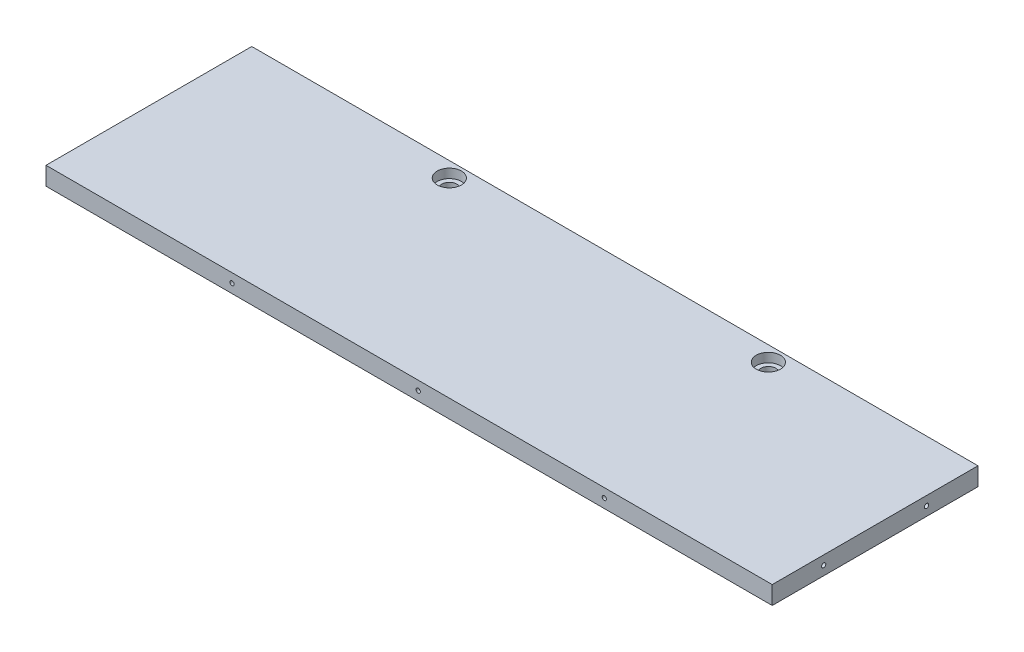
ISO-10303-21;
HEADER;
FILE_DESCRIPTION(('STEP AP214'),'2;1');
FILE_NAME('part.step','',(''),(''),'','','');
FILE_SCHEMA(('AUTOMOTIVE_DESIGN { 1 0 10303 214 1 1 1 1 }'));
ENDSEC;
DATA;
#1=APPLICATION_CONTEXT('core data for automotive mechanical design processes');
#2=APPLICATION_PROTOCOL_DEFINITION('international standard','automotive_design',2000,#1);
#3=PRODUCT_CONTEXT('',#1,'mechanical');
#4=PRODUCT('Part','Part','',(#3));
#5=PRODUCT_RELATED_PRODUCT_CATEGORY('part','',(#4));
#6=PRODUCT_DEFINITION_FORMATION('','',#4);
#7=PRODUCT_DEFINITION_CONTEXT('part definition',#1,'design');
#8=PRODUCT_DEFINITION('design','',#6,#7);
#9=PRODUCT_DEFINITION_SHAPE('','',#8);
#10=(LENGTH_UNIT() NAMED_UNIT(*) SI_UNIT(.MILLI.,.METRE.));
#11=(NAMED_UNIT(*) PLANE_ANGLE_UNIT() SI_UNIT($,.RADIAN.));
#12=(NAMED_UNIT(*) SI_UNIT($,.STERADIAN.) SOLID_ANGLE_UNIT());
#13=UNCERTAINTY_MEASURE_WITH_UNIT(LENGTH_MEASURE(1.E-05),#10,'distance_accuracy_value','');
#14=(GEOMETRIC_REPRESENTATION_CONTEXT(3) GLOBAL_UNCERTAINTY_ASSIGNED_CONTEXT((#13)) GLOBAL_UNIT_ASSIGNED_CONTEXT((#10,
#11,#12)) REPRESENTATION_CONTEXT('',''));
#15=CARTESIAN_POINT('',(0.,0.,0.));
#16=DIRECTION('',(0.,0.,1.));
#17=DIRECTION('',(1.,0.,0.));
#18=AXIS2_PLACEMENT_3D('',#15,#16,#17);
#19=CARTESIAN_POINT('',(-24.857141963306,0.,-14.5000000409357));
#20=DIRECTION('',(0.,1.,0.));
#21=DIRECTION('',(0.,0.,1.));
#22=AXIS2_PLACEMENT_3D('',#19,#20,#21);
#23=CYLINDRICAL_SURFACE('',#22,1.25);
#24=CARTESIAN_POINT('',(-24.857141963306,0.,-14.5000000409357));
#25=DIRECTION('',(0.,1.,0.));
#26=DIRECTION('',(0.,0.,1.));
#27=AXIS2_PLACEMENT_3D('',#24,#25,#26);
#28=CIRCLE('',#27,1.25);
#29=CARTESIAN_POINT('',(-24.857141963306,0.,-13.2500000409357));
#30=VERTEX_POINT('',#29);
#31=EDGE_CURVE('E123',#30,#30,#28,.T.);
#32=ORIENTED_EDGE('',*,*,#31,.F.);
#33=EDGE_LOOP('',(#32));
#34=FACE_BOUND('',#33,.T.);
#35=CARTESIAN_POINT('',(-24.857141963306,1.5,-14.5000000409357));
#36=DIRECTION('',(0.,1.,0.));
#37=DIRECTION('',(0.,0.,1.));
#38=AXIS2_PLACEMENT_3D('',#35,#36,#37);
#39=CIRCLE('',#38,1.25);
#40=CARTESIAN_POINT('',(-24.857141963306,1.5,-13.2500000409357));
#41=VERTEX_POINT('',#40);
#42=EDGE_CURVE('E43',#41,#41,#39,.F.);
#43=ORIENTED_EDGE('',*,*,#42,.F.);
#44=EDGE_LOOP('',(#43));
#45=FACE_BOUND('',#44,.T.);
#46=ADVANCED_FACE('F39',(#34,#45),#23,.F.);
#47=CARTESIAN_POINT('',(27.8571437509797,0.,-14.5000000409357));
#48=DIRECTION('',(0.,1.,0.));
#49=DIRECTION('',(0.,0.,1.));
#50=AXIS2_PLACEMENT_3D('',#47,#48,#49);
#51=CYLINDRICAL_SURFACE('',#50,1.25);
#52=CARTESIAN_POINT('',(27.8571437509797,0.,-14.5000000409357));
#53=DIRECTION('',(0.,1.,0.));
#54=DIRECTION('',(0.,0.,1.));
#55=AXIS2_PLACEMENT_3D('',#52,#53,#54);
#56=CIRCLE('',#55,1.25);
#57=CARTESIAN_POINT('',(27.8571437509797,0.,-13.2500000409357));
#58=VERTEX_POINT('',#57);
#59=EDGE_CURVE('E112',#58,#58,#56,.T.);
#60=ORIENTED_EDGE('',*,*,#59,.F.);
#61=EDGE_LOOP('',(#60));
#62=FACE_BOUND('',#61,.T.);
#63=CARTESIAN_POINT('',(27.8571437509797,1.5,-14.5000000409357));
#64=DIRECTION('',(0.,1.,0.));
#65=DIRECTION('',(0.,0.,1.));
#66=AXIS2_PLACEMENT_3D('',#63,#64,#65);
#67=CIRCLE('',#66,1.25);
#68=CARTESIAN_POINT('',(27.8571437509797,1.5,-13.2500000409357));
#69=VERTEX_POINT('',#68);
#70=EDGE_CURVE('E117',#69,#69,#67,.F.);
#71=ORIENTED_EDGE('',*,*,#70,.F.);
#72=EDGE_LOOP('',(#71));
#73=FACE_BOUND('',#72,.T.);
#74=ADVANCED_FACE('F151',(#62,#73),#51,.F.);
#75=CARTESIAN_POINT('',(-60.,3.,17.));
#76=DIRECTION('',(-1.,0.,0.));
#77=DIRECTION('',(0.,0.,1.));
#78=AXIS2_PLACEMENT_3D('',#75,#76,#77);
#79=PLANE('',#78);
#80=DIRECTION('',(0.,0.,-1.));
#81=VECTOR('',#80,1.);
#82=CARTESIAN_POINT('',(-60.,0.,17.));
#83=LINE('',#82,#81);
#84=CARTESIAN_POINT('',(-60.,0.,17.));
#85=VERTEX_POINT('',#84);
#86=CARTESIAN_POINT('',(-60.,0.,-17.));
#87=VERTEX_POINT('',#86);
#88=EDGE_CURVE('E108',#85,#87,#83,.T.);
#89=ORIENTED_EDGE('',*,*,#88,.F.);
#90=DIRECTION('',(0.,-1.,0.));
#91=VECTOR('',#90,1.);
#92=CARTESIAN_POINT('',(-60.,3.,17.));
#93=LINE('',#92,#91);
#94=CARTESIAN_POINT('',(-60.,3.,17.));
#95=VERTEX_POINT('',#94);
#96=EDGE_CURVE('E11',#95,#85,#93,.T.);
#97=ORIENTED_EDGE('',*,*,#96,.F.);
#98=DIRECTION('',(0.,0.,-1.));
#99=VECTOR('',#98,1.);
#100=CARTESIAN_POINT('',(-60.,3.,17.));
#101=LINE('',#100,#99);
#102=CARTESIAN_POINT('',(-60.,3.,-17.));
#103=VERTEX_POINT('',#102);
#104=EDGE_CURVE('E102',#95,#103,#101,.T.);
#105=ORIENTED_EDGE('',*,*,#104,.T.);
#106=DIRECTION('',(0.,-1.,0.));
#107=VECTOR('',#106,1.);
#108=CARTESIAN_POINT('',(-60.,3.,-17.));
#109=LINE('',#108,#107);
#110=EDGE_CURVE('E81',#103,#87,#109,.T.);
#111=ORIENTED_EDGE('',*,*,#110,.T.);
#112=EDGE_LOOP('',(#89,#97,#105,#111));
#113=FACE_BOUND('',#112,.T.);
#114=ADVANCED_FACE('F41',(#113),#79,.T.);
#115=CARTESIAN_POINT('',(-60.,3.,17.));
#116=DIRECTION('',(0.,0.,-1.));
#117=DIRECTION('',(-1.,0.,0.));
#118=AXIS2_PLACEMENT_3D('',#115,#116,#117);
#119=PLANE('',#118);
#120=CARTESIAN_POINT('',(-29.25,1.5,17.));
#121=DIRECTION('',(0.,0.,1.));
#122=DIRECTION('',(1.,0.,0.));
#123=AXIS2_PLACEMENT_3D('',#120,#121,#122);
#124=CIRCLE('',#123,0.350000000000001);
#125=CARTESIAN_POINT('',(-28.9,1.5,17.));
#126=VERTEX_POINT('',#125);
#127=EDGE_CURVE('E407',#126,#126,#124,.T.);
#128=ORIENTED_EDGE('',*,*,#127,.F.);
#129=EDGE_LOOP('',(#128));
#130=FACE_BOUND('',#129,.T.);
#131=CARTESIAN_POINT('',(1.50000000000002,1.49999999999999,17.));
#132=DIRECTION('',(0.,0.,1.));
#133=DIRECTION('',(1.,0.,0.));
#134=AXIS2_PLACEMENT_3D('',#131,#132,#133);
#135=CIRCLE('',#134,0.35);
#136=CARTESIAN_POINT('',(1.85000000000002,1.49999999999999,17.));
#137=VERTEX_POINT('',#136);
#138=EDGE_CURVE('E412',#137,#137,#135,.T.);
#139=ORIENTED_EDGE('',*,*,#138,.F.);
#140=EDGE_LOOP('',(#139));
#141=FACE_BOUND('',#140,.T.);
#142=CARTESIAN_POINT('',(32.25,1.49999999999999,17.));
#143=DIRECTION('',(0.,0.,1.));
#144=DIRECTION('',(1.,0.,0.));
#145=AXIS2_PLACEMENT_3D('',#142,#143,#144);
#146=CIRCLE('',#145,0.350000000000001);
#147=CARTESIAN_POINT('',(32.6,1.49999999999999,17.));
#148=VERTEX_POINT('',#147);
#149=EDGE_CURVE('E420',#148,#148,#146,.T.);
#150=ORIENTED_EDGE('',*,*,#149,.F.);
#151=EDGE_LOOP('',(#150));
#152=FACE_BOUND('',#151,.T.);
#153=DIRECTION('',(1.,0.,0.));
#154=VECTOR('',#153,1.);
#155=CARTESIAN_POINT('',(-60.,0.,17.));
#156=LINE('',#155,#154);
#157=CARTESIAN_POINT('',(60.,0.,17.));
#158=VERTEX_POINT('',#157);
#159=EDGE_CURVE('E73',#85,#158,#156,.T.);
#160=ORIENTED_EDGE('',*,*,#159,.T.);
#161=DIRECTION('',(0.,-1.,0.));
#162=VECTOR('',#161,1.);
#163=CARTESIAN_POINT('',(60.,3.,17.));
#164=LINE('',#163,#162);
#165=CARTESIAN_POINT('',(60.,3.,17.));
#166=VERTEX_POINT('',#165);
#167=EDGE_CURVE('E49',#166,#158,#164,.T.);
#168=ORIENTED_EDGE('',*,*,#167,.F.);
#169=DIRECTION('',(1.,0.,0.));
#170=VECTOR('',#169,1.);
#171=CARTESIAN_POINT('',(-60.,3.,17.));
#172=LINE('',#171,#170);
#173=EDGE_CURVE('E91',#95,#166,#172,.T.);
#174=ORIENTED_EDGE('',*,*,#173,.F.);
#175=ORIENTED_EDGE('',*,*,#96,.T.);
#176=EDGE_LOOP('',(#160,#168,#174,#175));
#177=FACE_BOUND('',#176,.T.);
#178=ADVANCED_FACE('F186',(#130,#141,#152,#177),#119,.F.);
#179=CARTESIAN_POINT('',(60.,3.,17.));
#180=DIRECTION('',(-1.,0.,0.));
#181=DIRECTION('',(0.,0.,1.));
#182=AXIS2_PLACEMENT_3D('',#179,#180,#181);
#183=PLANE('',#182);
#184=CARTESIAN_POINT('',(60.,1.50000000000003,8.50000000000002));
#185=DIRECTION('',(1.,0.,0.));
#186=DIRECTION('',(0.,0.,-1.));
#187=AXIS2_PLACEMENT_3D('',#184,#185,#186);
#188=CIRCLE('',#187,0.349999999999999);
#189=CARTESIAN_POINT('',(60.,1.50000000000003,8.15000000000002));
#190=VERTEX_POINT('',#189);
#191=EDGE_CURVE('E428',#190,#190,#188,.T.);
#192=ORIENTED_EDGE('',*,*,#191,.F.);
#193=EDGE_LOOP('',(#192));
#194=FACE_BOUND('',#193,.T.);
#195=CARTESIAN_POINT('',(60.,1.50000000000003,-8.49999999999999));
#196=DIRECTION('',(1.,0.,0.));
#197=DIRECTION('',(0.,0.,-1.));
#198=AXIS2_PLACEMENT_3D('',#195,#196,#197);
#199=CIRCLE('',#198,0.349999999999999);
#200=CARTESIAN_POINT('',(60.,1.50000000000003,-8.84999999999999));
#201=VERTEX_POINT('',#200);
#202=EDGE_CURVE('E410',#201,#201,#199,.T.);
#203=ORIENTED_EDGE('',*,*,#202,.F.);
#204=EDGE_LOOP('',(#203));
#205=FACE_BOUND('',#204,.T.);
#206=DIRECTION('',(0.,0.,-1.));
#207=VECTOR('',#206,1.);
#208=CARTESIAN_POINT('',(60.,0.,17.));
#209=LINE('',#208,#207);
#210=CARTESIAN_POINT('',(60.,0.,-17.));
#211=VERTEX_POINT('',#210);
#212=EDGE_CURVE('E98',#158,#211,#209,.T.);
#213=ORIENTED_EDGE('',*,*,#212,.T.);
#214=DIRECTION('',(0.,-1.,0.));
#215=VECTOR('',#214,1.);
#216=CARTESIAN_POINT('',(60.,3.,-17.));
#217=LINE('',#216,#215);
#218=CARTESIAN_POINT('',(60.,3.,-17.));
#219=VERTEX_POINT('',#218);
#220=EDGE_CURVE('E95',#219,#211,#217,.T.);
#221=ORIENTED_EDGE('',*,*,#220,.F.);
#222=DIRECTION('',(0.,0.,-1.));
#223=VECTOR('',#222,1.);
#224=CARTESIAN_POINT('',(60.,3.,17.));
#225=LINE('',#224,#223);
#226=EDGE_CURVE('E86',#166,#219,#225,.T.);
#227=ORIENTED_EDGE('',*,*,#226,.F.);
#228=ORIENTED_EDGE('',*,*,#167,.T.);
#229=EDGE_LOOP('',(#213,#221,#227,#228));
#230=FACE_BOUND('',#229,.T.);
#231=ADVANCED_FACE('F96',(#194,#205,#230),#183,.F.);
#232=CARTESIAN_POINT('',(-60.,3.,-17.));
#233=DIRECTION('',(0.,0.,-1.));
#234=DIRECTION('',(-1.,0.,0.));
#235=AXIS2_PLACEMENT_3D('',#232,#233,#234);
#236=PLANE('',#235);
#237=DIRECTION('',(1.,0.,0.));
#238=VECTOR('',#237,1.);
#239=CARTESIAN_POINT('',(-60.,0.,-17.));
#240=LINE('',#239,#238);
#241=EDGE_CURVE('E111',#87,#211,#240,.T.);
#242=ORIENTED_EDGE('',*,*,#241,.F.);
#243=ORIENTED_EDGE('',*,*,#110,.F.);
#244=DIRECTION('',(1.,0.,0.));
#245=VECTOR('',#244,1.);
#246=CARTESIAN_POINT('',(-60.,3.,-17.));
#247=LINE('',#246,#245);
#248=EDGE_CURVE('E90',#103,#219,#247,.T.);
#249=ORIENTED_EDGE('',*,*,#248,.T.);
#250=ORIENTED_EDGE('',*,*,#220,.T.);
#251=EDGE_LOOP('',(#242,#243,#249,#250));
#252=FACE_BOUND('',#251,.T.);
#253=ADVANCED_FACE('F101',(#252),#236,.T.);
#254=CARTESIAN_POINT('',(0.,3.,0.));
#255=DIRECTION('',(0.,-1.,0.));
#256=DIRECTION('',(0.,0.,-1.));
#257=AXIS2_PLACEMENT_3D('',#254,#255,#256);
#258=PLANE('',#257);
#259=CARTESIAN_POINT('',(-24.857141963306,3.,-14.5000000409357));
#260=DIRECTION('',(0.,1.,0.));
#261=DIRECTION('',(0.,0.,1.));
#262=AXIS2_PLACEMENT_3D('',#259,#260,#261);
#263=CIRCLE('',#262,2.);
#264=CARTESIAN_POINT('',(-24.857141963306,3.,-12.5000000409357));
#265=VERTEX_POINT('',#264);
#266=EDGE_CURVE('E125',#265,#265,#263,.T.);
#267=ORIENTED_EDGE('',*,*,#266,.F.);
#268=EDGE_LOOP('',(#267));
#269=FACE_BOUND('',#268,.T.);
#270=CARTESIAN_POINT('',(27.8571437509797,3.,-14.5000000409357));
#271=DIRECTION('',(0.,1.,0.));
#272=DIRECTION('',(0.,0.,1.));
#273=AXIS2_PLACEMENT_3D('',#270,#271,#272);
#274=CIRCLE('',#273,2.);
#275=CARTESIAN_POINT('',(27.8571437509797,3.,-12.5000000409357));
#276=VERTEX_POINT('',#275);
#277=EDGE_CURVE('E130',#276,#276,#274,.T.);
#278=ORIENTED_EDGE('',*,*,#277,.F.);
#279=EDGE_LOOP('',(#278));
#280=FACE_BOUND('',#279,.T.);
#281=ORIENTED_EDGE('',*,*,#104,.F.);
#282=ORIENTED_EDGE('',*,*,#173,.T.);
#283=ORIENTED_EDGE('',*,*,#226,.T.);
#284=ORIENTED_EDGE('',*,*,#248,.F.);
#285=EDGE_LOOP('',(#281,#282,#283,#284));
#286=FACE_BOUND('',#285,.T.);
#287=ADVANCED_FACE('F89',(#269,#280,#286),#258,.F.);
#288=CARTESIAN_POINT('',(0.,0.,0.));
#289=DIRECTION('',(0.,-1.,0.));
#290=DIRECTION('',(0.,0.,-1.));
#291=AXIS2_PLACEMENT_3D('',#288,#289,#290);
#292=PLANE('',#291);
#293=ORIENTED_EDGE('',*,*,#59,.T.);
#294=EDGE_LOOP('',(#293));
#295=FACE_BOUND('',#294,.T.);
#296=ORIENTED_EDGE('',*,*,#31,.T.);
#297=EDGE_LOOP('',(#296));
#298=FACE_BOUND('',#297,.T.);
#299=ORIENTED_EDGE('',*,*,#88,.T.);
#300=ORIENTED_EDGE('',*,*,#241,.T.);
#301=ORIENTED_EDGE('',*,*,#212,.F.);
#302=ORIENTED_EDGE('',*,*,#159,.F.);
#303=EDGE_LOOP('',(#299,#300,#301,#302));
#304=FACE_BOUND('',#303,.T.);
#305=ADVANCED_FACE('F146',(#295,#298,#304),#292,.T.);
#306=CARTESIAN_POINT('',(27.8571437509797,1.5,-14.5000000409357));
#307=DIRECTION('',(0.,1.,0.));
#308=DIRECTION('',(0.,0.,1.));
#309=AXIS2_PLACEMENT_3D('',#306,#307,#308);
#310=PLANE('',#309);
#311=CARTESIAN_POINT('',(27.8571437509797,1.5,-14.5000000409357));
#312=DIRECTION('',(0.,1.,0.));
#313=DIRECTION('',(0.,0.,1.));
#314=AXIS2_PLACEMENT_3D('',#311,#312,#313);
#315=CIRCLE('',#314,2.);
#316=CARTESIAN_POINT('',(27.8571437509797,1.5,-12.5000000409357));
#317=VERTEX_POINT('',#316);
#318=EDGE_CURVE('E138',#317,#317,#315,.T.);
#319=ORIENTED_EDGE('',*,*,#318,.T.);
#320=EDGE_LOOP('',(#319));
#321=FACE_BOUND('',#320,.T.);
#322=ORIENTED_EDGE('',*,*,#70,.T.);
#323=EDGE_LOOP('',(#322));
#324=FACE_BOUND('',#323,.T.);
#325=ADVANCED_FACE('F167',(#321,#324),#310,.T.);
#326=CARTESIAN_POINT('',(27.8571437509797,1.5,-14.5000000409357));
#327=DIRECTION('',(0.,1.,0.));
#328=DIRECTION('',(0.,0.,1.));
#329=AXIS2_PLACEMENT_3D('',#326,#327,#328);
#330=CYLINDRICAL_SURFACE('',#329,2.);
#331=ORIENTED_EDGE('',*,*,#318,.F.);
#332=EDGE_LOOP('',(#331));
#333=FACE_BOUND('',#332,.T.);
#334=ORIENTED_EDGE('',*,*,#277,.T.);
#335=EDGE_LOOP('',(#334));
#336=FACE_BOUND('',#335,.T.);
#337=ADVANCED_FACE('F158',(#333,#336),#330,.F.);
#338=CARTESIAN_POINT('',(-24.857141963306,1.5,-14.5000000409357));
#339=DIRECTION('',(0.,1.,0.));
#340=DIRECTION('',(0.,0.,1.));
#341=AXIS2_PLACEMENT_3D('',#338,#339,#340);
#342=PLANE('',#341);
#343=CARTESIAN_POINT('',(-24.857141963306,1.5,-14.5000000409357));
#344=DIRECTION('',(0.,1.,0.));
#345=DIRECTION('',(0.,0.,1.));
#346=AXIS2_PLACEMENT_3D('',#343,#344,#345);
#347=CIRCLE('',#346,2.);
#348=CARTESIAN_POINT('',(-24.857141963306,1.5,-12.5000000409357));
#349=VERTEX_POINT('',#348);
#350=EDGE_CURVE('E119',#349,#349,#347,.T.);
#351=ORIENTED_EDGE('',*,*,#350,.T.);
#352=EDGE_LOOP('',(#351));
#353=FACE_BOUND('',#352,.T.);
#354=ORIENTED_EDGE('',*,*,#42,.T.);
#355=EDGE_LOOP('',(#354));
#356=FACE_BOUND('',#355,.T.);
#357=ADVANCED_FACE('F155',(#353,#356),#342,.T.);
#358=CARTESIAN_POINT('',(-24.857141963306,1.5,-14.5000000409357));
#359=DIRECTION('',(0.,1.,0.));
#360=DIRECTION('',(0.,0.,1.));
#361=AXIS2_PLACEMENT_3D('',#358,#359,#360);
#362=CYLINDRICAL_SURFACE('',#361,2.);
#363=ORIENTED_EDGE('',*,*,#350,.F.);
#364=EDGE_LOOP('',(#363));
#365=FACE_BOUND('',#364,.T.);
#366=ORIENTED_EDGE('',*,*,#266,.T.);
#367=EDGE_LOOP('',(#366));
#368=FACE_BOUND('',#367,.T.);
#369=ADVANCED_FACE('F157',(#365,#368),#362,.F.);
#370=CARTESIAN_POINT('',(57.,1.50000000000003,-8.49999999999999));
#371=DIRECTION('',(1.,0.,0.));
#372=DIRECTION('',(0.,0.,-1.));
#373=AXIS2_PLACEMENT_3D('',#370,#371,#372);
#374=CYLINDRICAL_SURFACE('',#373,0.349999999999999);
#375=CARTESIAN_POINT('',(57.,1.50000000000003,-8.49999999999999));
#376=DIRECTION('',(1.,0.,0.));
#377=DIRECTION('',(0.,0.,-1.));
#378=AXIS2_PLACEMENT_3D('',#375,#376,#377);
#379=CIRCLE('',#378,0.349999999999999);
#380=CARTESIAN_POINT('',(57.,1.50000000000003,-8.84999999999999));
#381=VERTEX_POINT('',#380);
#382=EDGE_CURVE('E133',#381,#381,#379,.T.);
#383=ORIENTED_EDGE('',*,*,#382,.F.);
#384=EDGE_LOOP('',(#383));
#385=FACE_BOUND('',#384,.T.);
#386=ORIENTED_EDGE('',*,*,#202,.T.);
#387=EDGE_LOOP('',(#386));
#388=FACE_BOUND('',#387,.T.);
#389=ADVANCED_FACE('F164',(#385,#388),#374,.F.);
#390=CARTESIAN_POINT('',(57.,1.50000000000003,-8.49999999999999));
#391=DIRECTION('',(1.,0.,0.));
#392=DIRECTION('',(0.,0.,-1.));
#393=AXIS2_PLACEMENT_3D('',#390,#391,#392);
#394=PLANE('',#393);
#395=ORIENTED_EDGE('',*,*,#382,.T.);
#396=EDGE_LOOP('',(#395));
#397=FACE_BOUND('',#396,.T.);
#398=ADVANCED_FACE('F171',(#397),#394,.T.);
#399=CARTESIAN_POINT('',(57.,1.50000000000003,8.50000000000002));
#400=DIRECTION('',(1.,0.,0.));
#401=DIRECTION('',(0.,0.,-1.));
#402=AXIS2_PLACEMENT_3D('',#399,#400,#401);
#403=CYLINDRICAL_SURFACE('',#402,0.349999999999999);
#404=CARTESIAN_POINT('',(57.,1.50000000000003,8.50000000000002));
#405=DIRECTION('',(1.,0.,0.));
#406=DIRECTION('',(0.,0.,-1.));
#407=AXIS2_PLACEMENT_3D('',#404,#405,#406);
#408=CIRCLE('',#407,0.349999999999999);
#409=CARTESIAN_POINT('',(57.,1.50000000000003,8.15000000000002));
#410=VERTEX_POINT('',#409);
#411=EDGE_CURVE('E141',#410,#410,#408,.T.);
#412=ORIENTED_EDGE('',*,*,#411,.F.);
#413=EDGE_LOOP('',(#412));
#414=FACE_BOUND('',#413,.T.);
#415=ORIENTED_EDGE('',*,*,#191,.T.);
#416=EDGE_LOOP('',(#415));
#417=FACE_BOUND('',#416,.T.);
#418=ADVANCED_FACE('F263',(#414,#417),#403,.F.);
#419=CARTESIAN_POINT('',(57.,1.50000000000003,8.50000000000002));
#420=DIRECTION('',(1.,0.,0.));
#421=DIRECTION('',(0.,0.,-1.));
#422=AXIS2_PLACEMENT_3D('',#419,#420,#421);
#423=PLANE('',#422);
#424=ORIENTED_EDGE('',*,*,#411,.T.);
#425=EDGE_LOOP('',(#424));
#426=FACE_BOUND('',#425,.T.);
#427=ADVANCED_FACE('F273',(#426),#423,.T.);
#428=CARTESIAN_POINT('',(32.25,1.49999999999999,14.));
#429=DIRECTION('',(0.,0.,1.));
#430=DIRECTION('',(1.,0.,0.));
#431=AXIS2_PLACEMENT_3D('',#428,#429,#430);
#432=CYLINDRICAL_SURFACE('',#431,0.350000000000001);
#433=CARTESIAN_POINT('',(32.25,1.49999999999999,14.));
#434=DIRECTION('',(0.,0.,1.));
#435=DIRECTION('',(1.,0.,0.));
#436=AXIS2_PLACEMENT_3D('',#433,#434,#435);
#437=CIRCLE('',#436,0.350000000000001);
#438=CARTESIAN_POINT('',(32.6,1.49999999999999,14.));
#439=VERTEX_POINT('',#438);
#440=EDGE_CURVE('E423',#439,#439,#437,.T.);
#441=ORIENTED_EDGE('',*,*,#440,.F.);
#442=EDGE_LOOP('',(#441));
#443=FACE_BOUND('',#442,.T.);
#444=ORIENTED_EDGE('',*,*,#149,.T.);
#445=EDGE_LOOP('',(#444));
#446=FACE_BOUND('',#445,.T.);
#447=ADVANCED_FACE('F283',(#443,#446),#432,.F.);
#448=CARTESIAN_POINT('',(32.25,1.49999999999999,14.));
#449=DIRECTION('',(0.,0.,1.));
#450=DIRECTION('',(1.,0.,0.));
#451=AXIS2_PLACEMENT_3D('',#448,#449,#450);
#452=PLANE('',#451);
#453=ORIENTED_EDGE('',*,*,#440,.T.);
#454=EDGE_LOOP('',(#453));
#455=FACE_BOUND('',#454,.T.);
#456=ADVANCED_FACE('F299',(#455),#452,.T.);
#457=CARTESIAN_POINT('',(1.50000000000002,1.49999999999999,14.));
#458=DIRECTION('',(0.,0.,1.));
#459=DIRECTION('',(1.,0.,0.));
#460=AXIS2_PLACEMENT_3D('',#457,#458,#459);
#461=CYLINDRICAL_SURFACE('',#460,0.35);
#462=CARTESIAN_POINT('',(1.50000000000002,1.49999999999999,14.));
#463=DIRECTION('',(0.,0.,1.));
#464=DIRECTION('',(1.,0.,0.));
#465=AXIS2_PLACEMENT_3D('',#462,#463,#464);
#466=CIRCLE('',#465,0.35);
#467=CARTESIAN_POINT('',(1.85000000000002,1.49999999999999,14.));
#468=VERTEX_POINT('',#467);
#469=EDGE_CURVE('E417',#468,#468,#466,.T.);
#470=ORIENTED_EDGE('',*,*,#469,.F.);
#471=EDGE_LOOP('',(#470));
#472=FACE_BOUND('',#471,.T.);
#473=ORIENTED_EDGE('',*,*,#138,.T.);
#474=EDGE_LOOP('',(#473));
#475=FACE_BOUND('',#474,.T.);
#476=ADVANCED_FACE('F310',(#472,#475),#461,.F.);
#477=CARTESIAN_POINT('',(1.50000000000002,1.49999999999999,14.));
#478=DIRECTION('',(0.,0.,1.));
#479=DIRECTION('',(1.,0.,0.));
#480=AXIS2_PLACEMENT_3D('',#477,#478,#479);
#481=PLANE('',#480);
#482=ORIENTED_EDGE('',*,*,#469,.T.);
#483=EDGE_LOOP('',(#482));
#484=FACE_BOUND('',#483,.T.);
#485=ADVANCED_FACE('F321',(#484),#481,.T.);
#486=CARTESIAN_POINT('',(-29.25,1.5,14.));
#487=DIRECTION('',(0.,0.,1.));
#488=DIRECTION('',(1.,0.,0.));
#489=AXIS2_PLACEMENT_3D('',#486,#487,#488);
#490=CYLINDRICAL_SURFACE('',#489,0.350000000000001);
#491=CARTESIAN_POINT('',(-29.25,1.5,14.));
#492=DIRECTION('',(0.,0.,1.));
#493=DIRECTION('',(1.,0.,0.));
#494=AXIS2_PLACEMENT_3D('',#491,#492,#493);
#495=CIRCLE('',#494,0.350000000000001);
#496=CARTESIAN_POINT('',(-28.9,1.5,14.));
#497=VERTEX_POINT('',#496);
#498=EDGE_CURVE('E406',#497,#497,#495,.T.);
#499=ORIENTED_EDGE('',*,*,#498,.F.);
#500=EDGE_LOOP('',(#499));
#501=FACE_BOUND('',#500,.T.);
#502=ORIENTED_EDGE('',*,*,#127,.T.);
#503=EDGE_LOOP('',(#502));
#504=FACE_BOUND('',#503,.T.);
#505=ADVANCED_FACE('F332',(#501,#504),#490,.F.);
#506=CARTESIAN_POINT('',(-29.25,1.5,14.));
#507=DIRECTION('',(0.,0.,1.));
#508=DIRECTION('',(1.,0.,0.));
#509=AXIS2_PLACEMENT_3D('',#506,#507,#508);
#510=PLANE('',#509);
#511=ORIENTED_EDGE('',*,*,#498,.T.);
#512=EDGE_LOOP('',(#511));
#513=FACE_BOUND('',#512,.T.);
#514=ADVANCED_FACE('F343',(#513),#510,.T.);
#515=CLOSED_SHELL('',(#46,#74,#114,#178,#231,#253,#287,#305,#325,#337,#357,#369,#389,#398,#418,
#427,#447,#456,#476,#485,#505,#514));
#516=MANIFOLD_SOLID_BREP('B2',#515);
#517=ADVANCED_BREP_SHAPE_REPRESENTATION('',(#18,#516),#14);
#518=SHAPE_DEFINITION_REPRESENTATION(#9,#517);
ENDSEC;
END-ISO-10303-21;
